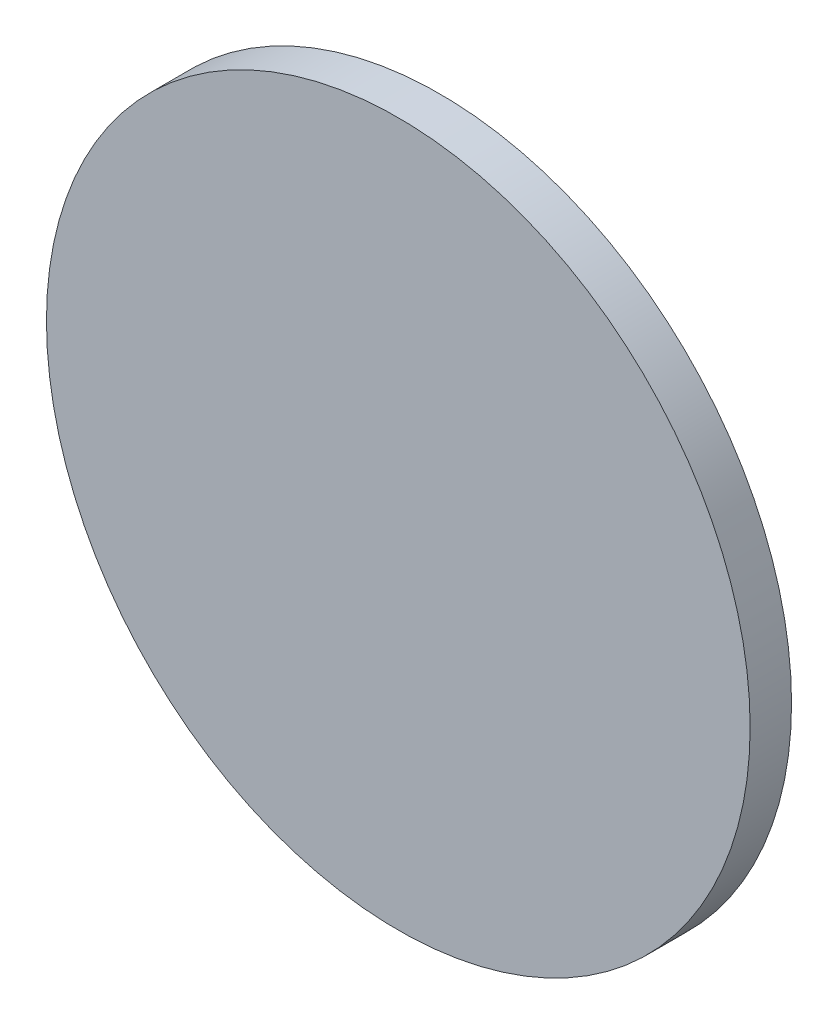
ISO-10303-21;
HEADER;
FILE_DESCRIPTION(('STEP AP214'),'2;1');
FILE_NAME('part.step','',(''),(''),'','','');
FILE_SCHEMA(('AUTOMOTIVE_DESIGN { 1 0 10303 214 1 1 1 1 }'));
ENDSEC;
DATA;
#1=APPLICATION_CONTEXT('core data for automotive mechanical design processes');
#2=APPLICATION_PROTOCOL_DEFINITION('international standard','automotive_design',2000,#1);
#3=PRODUCT_CONTEXT('',#1,'mechanical');
#4=PRODUCT('Part','Part','',(#3));
#5=PRODUCT_RELATED_PRODUCT_CATEGORY('part','',(#4));
#6=PRODUCT_DEFINITION_FORMATION('','',#4);
#7=PRODUCT_DEFINITION_CONTEXT('part definition',#1,'design');
#8=PRODUCT_DEFINITION('design','',#6,#7);
#9=PRODUCT_DEFINITION_SHAPE('','',#8);
#10=(LENGTH_UNIT() NAMED_UNIT(*) SI_UNIT(.MILLI.,.METRE.));
#11=(NAMED_UNIT(*) PLANE_ANGLE_UNIT() SI_UNIT($,.RADIAN.));
#12=(NAMED_UNIT(*) SI_UNIT($,.STERADIAN.) SOLID_ANGLE_UNIT());
#13=UNCERTAINTY_MEASURE_WITH_UNIT(LENGTH_MEASURE(1.E-05),#10,'distance_accuracy_value','');
#14=(GEOMETRIC_REPRESENTATION_CONTEXT(3) GLOBAL_UNCERTAINTY_ASSIGNED_CONTEXT((#13)) GLOBAL_UNIT_ASSIGNED_CONTEXT((#10,
#11,#12)) REPRESENTATION_CONTEXT('',''));
#15=CARTESIAN_POINT('',(0.,0.,0.));
#16=DIRECTION('',(0.,0.,1.));
#17=DIRECTION('',(1.,0.,0.));
#18=AXIS2_PLACEMENT_3D('',#15,#16,#17);
#19=CARTESIAN_POINT('',(0.,0.,4.));
#20=DIRECTION('',(0.,0.,-1.));
#21=DIRECTION('',(-1.,0.,0.));
#22=AXIS2_PLACEMENT_3D('',#19,#20,#21);
#23=CYLINDRICAL_SURFACE('',#22,34.);
#24=CARTESIAN_POINT('',(0.,0.,4.));
#25=DIRECTION('',(0.,0.,1.));
#26=DIRECTION('',(1.,0.,0.));
#27=AXIS2_PLACEMENT_3D('',#24,#25,#26);
#28=CIRCLE('',#27,34.);
#29=CARTESIAN_POINT('',(34.,0.,4.));
#30=VERTEX_POINT('',#29);
#31=EDGE_CURVE('E10',#30,#30,#28,.T.);
#32=ORIENTED_EDGE('',*,*,#31,.F.);
#33=EDGE_LOOP('',(#32));
#34=FACE_BOUND('',#33,.T.);
#35=CARTESIAN_POINT('',(0.,0.,0.));
#36=DIRECTION('',(0.,0.,1.));
#37=DIRECTION('',(1.,0.,0.));
#38=AXIS2_PLACEMENT_3D('',#35,#36,#37);
#39=CIRCLE('',#38,34.);
#40=CARTESIAN_POINT('',(34.,0.,0.));
#41=VERTEX_POINT('',#40);
#42=EDGE_CURVE('E40',#41,#41,#39,.T.);
#43=ORIENTED_EDGE('',*,*,#42,.T.);
#44=EDGE_LOOP('',(#43));
#45=FACE_BOUND('',#44,.T.);
#46=ADVANCED_FACE('F37',(#34,#45),#23,.T.);
#47=CARTESIAN_POINT('',(0.,0.,4.));
#48=DIRECTION('',(0.,0.,1.));
#49=DIRECTION('',(1.,0.,0.));
#50=AXIS2_PLACEMENT_3D('',#47,#48,#49);
#51=PLANE('',#50);
#52=ORIENTED_EDGE('',*,*,#31,.T.);
#53=EDGE_LOOP('',(#52));
#54=FACE_BOUND('',#53,.T.);
#55=ADVANCED_FACE('F54',(#54),#51,.T.);
#56=CARTESIAN_POINT('',(0.,0.,0.));
#57=DIRECTION('',(0.,0.,1.));
#58=DIRECTION('',(1.,0.,0.));
#59=AXIS2_PLACEMENT_3D('',#56,#57,#58);
#60=PLANE('',#59);
#61=ORIENTED_EDGE('',*,*,#42,.F.);
#62=EDGE_LOOP('',(#61));
#63=FACE_BOUND('',#62,.T.);
#64=ADVANCED_FACE('F52',(#63),#60,.F.);
#65=CLOSED_SHELL('',(#46,#55,#64));
#66=MANIFOLD_SOLID_BREP('B2',#65);
#67=ADVANCED_BREP_SHAPE_REPRESENTATION('',(#18,#66),#14);
#68=SHAPE_DEFINITION_REPRESENTATION(#9,#67);
ENDSEC;
END-ISO-10303-21;
